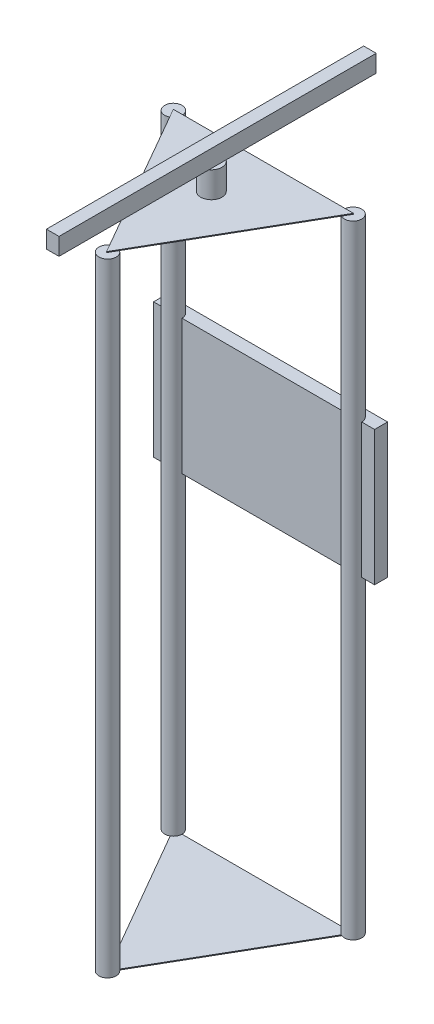
ISO-10303-21;
HEADER;
FILE_DESCRIPTION(('STEP AP214'),'2;1');
FILE_NAME('part.step','',(''),(''),'','','');
FILE_SCHEMA(('AUTOMOTIVE_DESIGN { 1 0 10303 214 1 1 1 1 }'));
ENDSEC;
DATA;
#1=APPLICATION_CONTEXT('core data for automotive mechanical design processes');
#2=APPLICATION_PROTOCOL_DEFINITION('international standard','automotive_design',2000,#1);
#3=PRODUCT_CONTEXT('',#1,'mechanical');
#4=PRODUCT('Part','Part','',(#3));
#5=PRODUCT_RELATED_PRODUCT_CATEGORY('part','',(#4));
#6=PRODUCT_DEFINITION_FORMATION('','',#4);
#7=PRODUCT_DEFINITION_CONTEXT('part definition',#1,'design');
#8=PRODUCT_DEFINITION('design','',#6,#7);
#9=PRODUCT_DEFINITION_SHAPE('','',#8);
#10=(LENGTH_UNIT() NAMED_UNIT(*) SI_UNIT(.MILLI.,.METRE.));
#11=(NAMED_UNIT(*) PLANE_ANGLE_UNIT() SI_UNIT($,.RADIAN.));
#12=(NAMED_UNIT(*) SI_UNIT($,.STERADIAN.) SOLID_ANGLE_UNIT());
#13=UNCERTAINTY_MEASURE_WITH_UNIT(LENGTH_MEASURE(1.E-05),#10,'distance_accuracy_value','');
#14=(GEOMETRIC_REPRESENTATION_CONTEXT(3) GLOBAL_UNCERTAINTY_ASSIGNED_CONTEXT((#13)) GLOBAL_UNIT_ASSIGNED_CONTEXT((#10,
#11,#12)) REPRESENTATION_CONTEXT('',''));
#15=CARTESIAN_POINT('',(0.,0.,0.));
#16=DIRECTION('',(0.,0.,1.));
#17=DIRECTION('',(1.,0.,0.));
#18=AXIS2_PLACEMENT_3D('',#15,#16,#17);
#19=CARTESIAN_POINT('',(-263.964543073504,1831.34,-152.400000000004));
#20=DIRECTION('',(0.,-1.,0.));
#21=DIRECTION('',(0.,0.,-1.));
#22=AXIS2_PLACEMENT_3D('',#19,#20,#21);
#23=CYLINDRICAL_SURFACE('',#22,25.4);
#24=CARTESIAN_POINT('',(-263.964543073504,2.54,-152.400000000004));
#25=DIRECTION('',(0.,1.,0.));
#26=DIRECTION('',(0.,0.,1.));
#27=AXIS2_PLACEMENT_3D('',#24,#25,#26);
#28=CIRCLE('',#27,25.4);
#29=CARTESIAN_POINT('',(-251.264543073504,2.54,-130.402954743879));
#30=VERTEX_POINT('',#29);
#31=CARTESIAN_POINT('',(-238.564543073504,2.54,-152.400000000004));
#32=VERTEX_POINT('',#31);
#33=EDGE_CURVE('E383',#30,#32,#28,.T.);
#34=ORIENTED_EDGE('',*,*,#33,.T.);
#35=EDGE_CURVE('E373',#32,#30,#28,.T.);
#36=ORIENTED_EDGE('',*,*,#35,.T.);
#37=EDGE_LOOP('',(#34,#36));
#38=FACE_BOUND('',#37,.T.);
#39=CARTESIAN_POINT('',(-263.964543073504,1831.34,-152.400000000004));
#40=DIRECTION('',(0.,1.,0.));
#41=DIRECTION('',(0.,0.,1.));
#42=AXIS2_PLACEMENT_3D('',#39,#40,#41);
#43=CIRCLE('',#42,25.4);
#44=CARTESIAN_POINT('',(-251.325258466089,1831.34,-130.368012241004));
#45=VERTEX_POINT('',#44);
#46=CARTESIAN_POINT('',(-238.564543073504,1831.34,-152.400000000004));
#47=VERTEX_POINT('',#46);
#48=EDGE_CURVE('E378',#45,#47,#43,.T.);
#49=ORIENTED_EDGE('',*,*,#48,.F.);
#50=EDGE_CURVE('E382',#47,#45,#43,.T.);
#51=ORIENTED_EDGE('',*,*,#50,.F.);
#52=EDGE_LOOP('',(#49,#51));
#53=FACE_BOUND('',#52,.T.);
#54=CARTESIAN_POINT('',(-263.964543073504,1315.11447139474,-152.400000000004));
#55=DIRECTION('',(0.,-1.,0.));
#56=DIRECTION('',(0.,0.,-1.));
#57=AXIS2_PLACEMENT_3D('',#54,#55,#56);
#58=CIRCLE('',#57,25.4);
#59=CARTESIAN_POINT('',(-289.364543073504,1315.11447139474,-152.400000000005));
#60=VERTEX_POINT('',#59);
#61=CARTESIAN_POINT('',(-238.564543073504,1315.11447139474,-152.400000000005));
#62=VERTEX_POINT('',#61);
#63=EDGE_CURVE('E72',#60,#62,#58,.T.);
#64=ORIENTED_EDGE('',*,*,#63,.F.);
#65=DIRECTION('',(0.,-1.,0.));
#66=VECTOR('',#65,1.);
#67=CARTESIAN_POINT('',(-289.364543073504,1831.34,-152.400000000005));
#68=LINE('',#67,#66);
#69=CARTESIAN_POINT('',(-289.364543073504,919.738310770345,-152.400000000004));
#70=VERTEX_POINT('',#69);
#71=EDGE_CURVE('E286',#60,#70,#68,.T.);
#72=ORIENTED_EDGE('',*,*,#71,.T.);
#73=CARTESIAN_POINT('',(-263.964543073504,919.738310770345,-152.400000000004));
#74=DIRECTION('',(0.,1.,0.));
#75=DIRECTION('',(0.,0.,1.));
#76=AXIS2_PLACEMENT_3D('',#73,#74,#75);
#77=CIRCLE('',#76,25.4);
#78=CARTESIAN_POINT('',(-238.564543073504,919.738310770345,-152.400000000004));
#79=VERTEX_POINT('',#78);
#80=EDGE_CURVE('E235',#79,#70,#77,.T.);
#81=ORIENTED_EDGE('',*,*,#80,.F.);
#82=DIRECTION('',(0.,-1.,0.));
#83=VECTOR('',#82,1.);
#84=CARTESIAN_POINT('',(-238.564543073504,1831.34,-152.400000000005));
#85=LINE('',#84,#83);
#86=EDGE_CURVE('E77',#79,#62,#85,.F.);
#87=ORIENTED_EDGE('',*,*,#86,.T.);
#88=EDGE_LOOP('',(#64,#72,#81,#87));
#89=FACE_BOUND('',#88,.T.);
#90=ADVANCED_FACE('F57',(#38,#53,#89),#23,.T.);
#91=CARTESIAN_POINT('',(263.964543073505,1831.34,-152.400000000004));
#92=DIRECTION('',(0.,-1.,0.));
#93=DIRECTION('',(0.,0.,-1.));
#94=AXIS2_PLACEMENT_3D('',#91,#92,#93);
#95=CYLINDRICAL_SURFACE('',#94,25.4);
#96=CARTESIAN_POINT('',(263.964543073505,2.54,-152.400000000004));
#97=DIRECTION('',(0.,1.,0.));
#98=DIRECTION('',(0.,0.,1.));
#99=AXIS2_PLACEMENT_3D('',#96,#97,#98);
#100=CIRCLE('',#99,25.4);
#101=CARTESIAN_POINT('',(238.564543073505,2.53999999999999,-152.400000000004));
#102=VERTEX_POINT('',#101);
#103=CARTESIAN_POINT('',(251.264543073505,2.54,-130.40295474388));
#104=VERTEX_POINT('',#103);
#105=EDGE_CURVE('E362',#102,#104,#100,.T.);
#106=ORIENTED_EDGE('',*,*,#105,.T.);
#107=EDGE_CURVE('E366',#104,#102,#100,.T.);
#108=ORIENTED_EDGE('',*,*,#107,.T.);
#109=EDGE_LOOP('',(#106,#108));
#110=FACE_BOUND('',#109,.T.);
#111=CARTESIAN_POINT('',(263.964543073505,1831.34,-152.400000000004));
#112=DIRECTION('',(0.,1.,0.));
#113=DIRECTION('',(0.,0.,1.));
#114=AXIS2_PLACEMENT_3D('',#111,#112,#113);
#115=CIRCLE('',#114,25.4);
#116=CARTESIAN_POINT('',(238.564543073505,1831.34,-152.400000000004));
#117=VERTEX_POINT('',#116);
#118=CARTESIAN_POINT('',(252.11665213693,1831.34,-129.932523943379));
#119=VERTEX_POINT('',#118);
#120=EDGE_CURVE('E367',#117,#119,#115,.T.);
#121=ORIENTED_EDGE('',*,*,#120,.F.);
#122=EDGE_CURVE('E359',#119,#117,#115,.T.);
#123=ORIENTED_EDGE('',*,*,#122,.F.);
#124=EDGE_LOOP('',(#121,#123));
#125=FACE_BOUND('',#124,.T.);
#126=CARTESIAN_POINT('',(263.964543073505,1315.11447139474,-152.400000000004));
#127=DIRECTION('',(0.,-1.,0.));
#128=DIRECTION('',(0.,0.,-1.));
#129=AXIS2_PLACEMENT_3D('',#126,#127,#128);
#130=CIRCLE('',#129,25.4);
#131=CARTESIAN_POINT('',(238.564543073505,1315.11447139474,-152.400000000005));
#132=VERTEX_POINT('',#131);
#133=CARTESIAN_POINT('',(289.364543073505,1315.11447139474,-152.400000000005));
#134=VERTEX_POINT('',#133);
#135=EDGE_CURVE('E13',#132,#134,#130,.T.);
#136=ORIENTED_EDGE('',*,*,#135,.F.);
#137=DIRECTION('',(0.,-1.,0.));
#138=VECTOR('',#137,1.);
#139=CARTESIAN_POINT('',(238.564543073505,1831.34,-152.400000000005));
#140=LINE('',#139,#138);
#141=CARTESIAN_POINT('',(238.564543073505,919.738310770345,-152.400000000004));
#142=VERTEX_POINT('',#141);
#143=EDGE_CURVE('E65',#132,#142,#140,.T.);
#144=ORIENTED_EDGE('',*,*,#143,.T.);
#145=CARTESIAN_POINT('',(263.964543073505,919.738310770345,-152.400000000004));
#146=DIRECTION('',(0.,1.,0.));
#147=DIRECTION('',(0.,0.,1.));
#148=AXIS2_PLACEMENT_3D('',#145,#146,#147);
#149=CIRCLE('',#148,25.4);
#150=CARTESIAN_POINT('',(289.364543073505,919.738310770345,-152.400000000004));
#151=VERTEX_POINT('',#150);
#152=EDGE_CURVE('E416',#151,#142,#149,.T.);
#153=ORIENTED_EDGE('',*,*,#152,.F.);
#154=DIRECTION('',(0.,-1.,0.));
#155=VECTOR('',#154,1.);
#156=CARTESIAN_POINT('',(289.364543073505,1831.34,-152.400000000005));
#157=LINE('',#156,#155);
#158=EDGE_CURVE('E419',#151,#134,#157,.F.);
#159=ORIENTED_EDGE('',*,*,#158,.T.);
#160=EDGE_LOOP('',(#136,#144,#153,#159));
#161=FACE_BOUND('',#160,.T.);
#162=ADVANCED_FACE('F422',(#110,#125,#161),#95,.T.);
#163=CARTESIAN_POINT('',(0.,1910.08,0.));
#164=DIRECTION('',(0.,1.,0.));
#165=DIRECTION('',(0.,0.,1.));
#166=AXIS2_PLACEMENT_3D('',#163,#164,#165);
#167=PLANE('',#166);
#168=DIRECTION('',(0.,0.,1.));
#169=VECTOR('',#168,1.);
#170=CARTESIAN_POINT('',(-18.4507159678555,1910.08,465.908665035179));
#171=LINE('',#170,#169);
#172=CARTESIAN_POINT('',(-18.4507159678555,1910.08,-25.0478078657152));
#173=VERTEX_POINT('',#172);
#174=CARTESIAN_POINT('',(-18.4507159678555,1910.08,25.0478078657152));
#175=VERTEX_POINT('',#174);
#176=EDGE_CURVE('E304',#173,#175,#171,.T.);
#177=ORIENTED_EDGE('',*,*,#176,.F.);
#178=CARTESIAN_POINT('',(0.,1910.08,0.));
#179=DIRECTION('',(0.,1.,0.));
#180=DIRECTION('',(0.,0.,1.));
#181=AXIS2_PLACEMENT_3D('',#178,#179,#180);
#182=CIRCLE('',#181,31.1098312210829);
#183=EDGE_CURVE('E590',#173,#175,#182,.T.);
#184=ORIENTED_EDGE('',*,*,#183,.T.);
#185=EDGE_LOOP('',(#177,#184));
#186=FACE_BOUND('',#185,.T.);
#187=ADVANCED_FACE('F482',(#186),#167,.T.);
#188=CARTESIAN_POINT('',(-263.964543073504,2.54,-152.400000000004));
#189=DIRECTION('',(0.866025403784438,0.,-0.5));
#190=DIRECTION('',(-0.5,0.,-0.866025403784439));
#191=AXIS2_PLACEMENT_3D('',#188,#189,#190);
#192=PLANE('',#191);
#193=DIRECTION('',(0.5,0.,0.866025403784438));
#194=VECTOR('',#193,1.);
#195=CARTESIAN_POINT('',(-263.964543073504,0.,-152.400000000004));
#196=LINE('',#195,#194);
#197=CARTESIAN_POINT('',(-263.964543073504,0.,-152.400000000004));
#198=VERTEX_POINT('',#197);
#199=CARTESIAN_POINT('',(0.,0.,304.800000000009));
#200=VERTEX_POINT('',#199);
#201=EDGE_CURVE('E381',#198,#200,#196,.T.);
#202=ORIENTED_EDGE('',*,*,#201,.T.);
#203=DIRECTION('',(0.,-1.,0.));
#204=VECTOR('',#203,1.);
#205=CARTESIAN_POINT('',(0.,2.54,304.800000000009));
#206=LINE('',#205,#204);
#207=CARTESIAN_POINT('',(0.,2.54,304.800000000009));
#208=VERTEX_POINT('',#207);
#209=EDGE_CURVE('E413',#208,#200,#206,.T.);
#210=ORIENTED_EDGE('',*,*,#209,.F.);
#211=DIRECTION('',(0.5,0.,0.866025403784438));
#212=VECTOR('',#211,1.);
#213=CARTESIAN_POINT('',(-263.964543073504,2.54,-152.400000000004));
#214=LINE('',#213,#212);
#215=CARTESIAN_POINT('',(-12.7,2.54,282.802954743884));
#216=VERTEX_POINT('',#215);
#217=EDGE_CURVE('E391',#216,#208,#214,.T.);
#218=ORIENTED_EDGE('',*,*,#217,.F.);
#219=EDGE_CURVE('E390',#30,#216,#214,.T.);
#220=ORIENTED_EDGE('',*,*,#219,.F.);
#221=CARTESIAN_POINT('',(-263.964543073504,2.54,-152.400000000004));
#222=VERTEX_POINT('',#221);
#223=EDGE_CURVE('E386',#222,#30,#214,.T.);
#224=ORIENTED_EDGE('',*,*,#223,.F.);
#225=DIRECTION('',(0.,-1.,0.));
#226=VECTOR('',#225,1.);
#227=CARTESIAN_POINT('',(-263.964543073504,2.54,-152.400000000004));
#228=LINE('',#227,#226);
#229=EDGE_CURVE('E400',#222,#198,#228,.T.);
#230=ORIENTED_EDGE('',*,*,#229,.T.);
#231=EDGE_LOOP('',(#202,#210,#218,#220,#224,#230));
#232=FACE_BOUND('',#231,.T.);
#233=ADVANCED_FACE('F59',(#232),#192,.F.);
#234=CARTESIAN_POINT('',(0.,2.54,304.800000000009));
#235=DIRECTION('',(-0.866025403784439,0.,-0.5));
#236=DIRECTION('',(-0.5,0.,0.866025403784439));
#237=AXIS2_PLACEMENT_3D('',#234,#235,#236);
#238=PLANE('',#237);
#239=DIRECTION('',(0.5,0.,-0.866025403784439));
#240=VECTOR('',#239,1.);
#241=CARTESIAN_POINT('',(0.,0.,304.800000000009));
#242=LINE('',#241,#240);
#243=CARTESIAN_POINT('',(263.964543073505,0.,-152.400000000004));
#244=VERTEX_POINT('',#243);
#245=EDGE_CURVE('E404',#200,#244,#242,.T.);
#246=ORIENTED_EDGE('',*,*,#245,.T.);
#247=DIRECTION('',(0.,-1.,0.));
#248=VECTOR('',#247,1.);
#249=CARTESIAN_POINT('',(263.964543073505,2.54,-152.400000000004));
#250=LINE('',#249,#248);
#251=CARTESIAN_POINT('',(263.964543073505,2.54,-152.400000000004));
#252=VERTEX_POINT('',#251);
#253=EDGE_CURVE('E410',#252,#244,#250,.T.);
#254=ORIENTED_EDGE('',*,*,#253,.F.);
#255=DIRECTION('',(0.5,0.,-0.866025403784439));
#256=VECTOR('',#255,1.);
#257=CARTESIAN_POINT('',(0.,2.54,304.800000000009));
#258=LINE('',#257,#256);
#259=EDGE_CURVE('E389',#104,#252,#258,.T.);
#260=ORIENTED_EDGE('',*,*,#259,.F.);
#261=CARTESIAN_POINT('',(12.7,2.53999999999999,282.802954743884));
#262=VERTEX_POINT('',#261);
#263=EDGE_CURVE('E396',#262,#104,#258,.T.);
#264=ORIENTED_EDGE('',*,*,#263,.F.);
#265=EDGE_CURVE('E392',#208,#262,#258,.T.);
#266=ORIENTED_EDGE('',*,*,#265,.F.);
#267=ORIENTED_EDGE('',*,*,#209,.T.);
#268=EDGE_LOOP('',(#246,#254,#260,#264,#266,#267));
#269=FACE_BOUND('',#268,.T.);
#270=ADVANCED_FACE('F500',(#269),#238,.F.);
#271=CARTESIAN_POINT('',(263.964543073505,2.54,-152.400000000004));
#272=DIRECTION('',(0.,0.,1.));
#273=DIRECTION('',(1.,0.,0.));
#274=AXIS2_PLACEMENT_3D('',#271,#272,#273);
#275=PLANE('',#274);
#276=DIRECTION('',(-1.,0.,0.));
#277=VECTOR('',#276,1.);
#278=CARTESIAN_POINT('',(263.964543073505,0.,-152.400000000004));
#279=LINE('',#278,#277);
#280=EDGE_CURVE('E406',#244,#198,#279,.T.);
#281=ORIENTED_EDGE('',*,*,#280,.T.);
#282=ORIENTED_EDGE('',*,*,#229,.F.);
#283=DIRECTION('',(-1.,0.,0.));
#284=VECTOR('',#283,1.);
#285=CARTESIAN_POINT('',(263.964543073505,2.54,-152.400000000004));
#286=LINE('',#285,#284);
#287=EDGE_CURVE('E395',#32,#222,#286,.T.);
#288=ORIENTED_EDGE('',*,*,#287,.F.);
#289=EDGE_CURVE('E401',#102,#32,#286,.T.);
#290=ORIENTED_EDGE('',*,*,#289,.F.);
#291=EDGE_CURVE('E397',#252,#102,#286,.T.);
#292=ORIENTED_EDGE('',*,*,#291,.F.);
#293=ORIENTED_EDGE('',*,*,#253,.T.);
#294=EDGE_LOOP('',(#281,#282,#288,#290,#292,#293));
#295=FACE_BOUND('',#294,.T.);
#296=ADVANCED_FACE('F494',(#295),#275,.F.);
#297=CARTESIAN_POINT('',(0.,2.54,0.));
#298=DIRECTION('',(0.,1.,0.));
#299=DIRECTION('',(0.,0.,1.));
#300=AXIS2_PLACEMENT_3D('',#297,#298,#299);
#301=PLANE('',#300);
#302=ORIENTED_EDGE('',*,*,#263,.T.);
#303=ORIENTED_EDGE('',*,*,#105,.F.);
#304=ORIENTED_EDGE('',*,*,#289,.T.);
#305=ORIENTED_EDGE('',*,*,#33,.F.);
#306=ORIENTED_EDGE('',*,*,#219,.T.);
#307=CARTESIAN_POINT('',(0.,2.54,304.800000000009));
#308=DIRECTION('',(0.,1.,0.));
#309=DIRECTION('',(0.,0.,1.));
#310=AXIS2_PLACEMENT_3D('',#307,#308,#309);
#311=CIRCLE('',#310,25.4);
#312=EDGE_CURVE('E370',#262,#216,#311,.T.);
#313=ORIENTED_EDGE('',*,*,#312,.F.);
#314=EDGE_LOOP('',(#302,#303,#304,#305,#306,#313));
#315=FACE_BOUND('',#314,.T.);
#316=ADVANCED_FACE('F490',(#315),#301,.T.);
#317=CARTESIAN_POINT('',(0.,0.,0.));
#318=DIRECTION('',(0.,1.,0.));
#319=DIRECTION('',(0.,0.,1.));
#320=AXIS2_PLACEMENT_3D('',#317,#318,#319);
#321=PLANE('',#320);
#322=ORIENTED_EDGE('',*,*,#201,.F.);
#323=ORIENTED_EDGE('',*,*,#280,.F.);
#324=ORIENTED_EDGE('',*,*,#245,.F.);
#325=EDGE_LOOP('',(#322,#323,#324));
#326=FACE_BOUND('',#325,.T.);
#327=ADVANCED_FACE('F493',(#326),#321,.F.);
#328=CARTESIAN_POINT('',(-263.964543073504,2.54,-152.400000000004));
#329=DIRECTION('',(0.,1.,0.));
#330=DIRECTION('',(0.,0.,1.));
#331=AXIS2_PLACEMENT_3D('',#328,#329,#330);
#332=PLANE('',#331);
#333=ORIENTED_EDGE('',*,*,#287,.T.);
#334=ORIENTED_EDGE('',*,*,#223,.T.);
#335=ORIENTED_EDGE('',*,*,#35,.F.);
#336=EDGE_LOOP('',(#333,#334,#335));
#337=FACE_BOUND('',#336,.T.);
#338=ADVANCED_FACE('F488',(#337),#332,.F.);
#339=CARTESIAN_POINT('',(-263.964543073504,1831.34,-152.400000000004));
#340=DIRECTION('',(0.,1.,0.));
#341=DIRECTION('',(0.,0.,1.));
#342=AXIS2_PLACEMENT_3D('',#339,#340,#341);
#343=PLANE('',#342);
#344=DIRECTION('',(0.49760963021322,0.,0.867401092874031));
#345=VECTOR('',#344,1.);
#346=CARTESIAN_POINT('',(-132.822896225479,1831.34,76.197681577291));
#347=LINE('',#346,#345);
#348=CARTESIAN_POINT('',(-263.964543073504,1831.34,-152.400000000004));
#349=VERTEX_POINT('',#348);
#350=EDGE_CURVE('E335',#349,#45,#347,.T.);
#351=ORIENTED_EDGE('',*,*,#350,.F.);
#352=DIRECTION('',(-1.,0.,0.));
#353=VECTOR('',#352,1.);
#354=CARTESIAN_POINT('',(0.,1831.34,-152.400000000004));
#355=LINE('',#354,#353);
#356=EDGE_CURVE('E343',#47,#349,#355,.T.);
#357=ORIENTED_EDGE('',*,*,#356,.F.);
#358=ORIENTED_EDGE('',*,*,#50,.T.);
#359=EDGE_LOOP('',(#351,#357,#358));
#360=FACE_BOUND('',#359,.T.);
#361=ADVANCED_FACE('F645',(#360),#343,.T.);
#362=CARTESIAN_POINT('',(0.,2.54,304.800000000009));
#363=DIRECTION('',(0.,1.,0.));
#364=DIRECTION('',(0.,0.,1.));
#365=AXIS2_PLACEMENT_3D('',#362,#363,#364);
#366=PLANE('',#365);
#367=EDGE_CURVE('E374',#216,#262,#311,.T.);
#368=ORIENTED_EDGE('',*,*,#367,.F.);
#369=ORIENTED_EDGE('',*,*,#217,.T.);
#370=ORIENTED_EDGE('',*,*,#265,.T.);
#371=EDGE_LOOP('',(#368,#369,#370));
#372=FACE_BOUND('',#371,.T.);
#373=ADVANCED_FACE('F529',(#372),#366,.F.);
#374=CARTESIAN_POINT('',(0.,1831.34,304.800000000009));
#375=DIRECTION('',(0.,-1.,0.));
#376=DIRECTION('',(0.,0.,-1.));
#377=AXIS2_PLACEMENT_3D('',#374,#375,#376);
#378=CYLINDRICAL_SURFACE('',#377,25.4);
#379=CARTESIAN_POINT('',(0.,1831.34,304.800000000009));
#380=DIRECTION('',(0.,1.,0.));
#381=DIRECTION('',(0.,0.,1.));
#382=AXIS2_PLACEMENT_3D('',#379,#380,#381);
#383=CIRCLE('',#382,25.4);
#384=CARTESIAN_POINT('',(13.9232604377271,1831.34,283.556111024983));
#385=VERTEX_POINT('',#384);
#386=CARTESIAN_POINT('',(-13.8814463158928,1831.34,283.528764770737));
#387=VERTEX_POINT('',#386);
#388=EDGE_CURVE('E375',#385,#387,#383,.T.);
#389=ORIENTED_EDGE('',*,*,#388,.F.);
#390=EDGE_CURVE('E365',#387,#385,#383,.T.);
#391=ORIENTED_EDGE('',*,*,#390,.F.);
#392=EDGE_LOOP('',(#389,#391));
#393=FACE_BOUND('',#392,.T.);
#394=ORIENTED_EDGE('',*,*,#312,.T.);
#395=ORIENTED_EDGE('',*,*,#367,.T.);
#396=EDGE_LOOP('',(#394,#395));
#397=FACE_BOUND('',#396,.T.);
#398=ADVANCED_FACE('F655',(#393,#397),#378,.T.);
#399=CARTESIAN_POINT('',(0.,1831.34,304.800000000009));
#400=DIRECTION('',(0.,1.,0.));
#401=DIRECTION('',(0.,0.,1.));
#402=AXIS2_PLACEMENT_3D('',#399,#400,#401);
#403=PLANE('',#402);
#404=DIRECTION('',(0.499159872059048,0.,-0.866509908844668));
#405=VECTOR('',#404,1.);
#406=CARTESIAN_POINT('',(133.099799832719,1831.34,76.6731902052547));
#407=LINE('',#406,#405);
#408=CARTESIAN_POINT('',(0.,1831.34,307.726008903489));
#409=VERTEX_POINT('',#408);
#410=EDGE_CURVE('E340',#409,#385,#407,.T.);
#411=ORIENTED_EDGE('',*,*,#410,.F.);
#412=EDGE_CURVE('E349',#387,#409,#347,.T.);
#413=ORIENTED_EDGE('',*,*,#412,.F.);
#414=ORIENTED_EDGE('',*,*,#390,.T.);
#415=EDGE_LOOP('',(#411,#413,#414));
#416=FACE_BOUND('',#415,.T.);
#417=ADVANCED_FACE('F666',(#416),#403,.T.);
#418=CARTESIAN_POINT('',(263.964543073505,2.54,-152.400000000004));
#419=DIRECTION('',(0.,1.,0.));
#420=DIRECTION('',(0.,0.,1.));
#421=AXIS2_PLACEMENT_3D('',#418,#419,#420);
#422=PLANE('',#421);
#423=ORIENTED_EDGE('',*,*,#107,.F.);
#424=ORIENTED_EDGE('',*,*,#259,.T.);
#425=ORIENTED_EDGE('',*,*,#291,.T.);
#426=EDGE_LOOP('',(#423,#424,#425));
#427=FACE_BOUND('',#426,.T.);
#428=ADVANCED_FACE('F532',(#427),#422,.F.);
#429=CARTESIAN_POINT('',(263.964543073505,1831.34,-152.400000000004));
#430=DIRECTION('',(0.,1.,0.));
#431=DIRECTION('',(0.,0.,1.));
#432=AXIS2_PLACEMENT_3D('',#429,#430,#431);
#433=PLANE('',#432);
#434=CARTESIAN_POINT('',(265.059219047523,1831.34,-152.400000000004));
#435=VERTEX_POINT('',#434);
#436=EDGE_CURVE('E345',#119,#435,#407,.T.);
#437=ORIENTED_EDGE('',*,*,#436,.F.);
#438=ORIENTED_EDGE('',*,*,#122,.T.);
#439=EDGE_CURVE('E346',#435,#117,#355,.T.);
#440=ORIENTED_EDGE('',*,*,#439,.F.);
#441=EDGE_LOOP('',(#437,#438,#440));
#442=FACE_BOUND('',#441,.T.);
#443=ADVANCED_FACE('F541',(#442),#433,.T.);
#444=CARTESIAN_POINT('',(0.,1831.34,0.));
#445=DIRECTION('',(0.,1.,0.));
#446=DIRECTION('',(0.,0.,1.));
#447=AXIS2_PLACEMENT_3D('',#444,#445,#446);
#448=PLANE('',#447);
#449=EDGE_CURVE('E353',#45,#387,#347,.T.);
#450=ORIENTED_EDGE('',*,*,#449,.F.);
#451=ORIENTED_EDGE('',*,*,#48,.T.);
#452=EDGE_CURVE('E350',#117,#47,#355,.T.);
#453=ORIENTED_EDGE('',*,*,#452,.F.);
#454=ORIENTED_EDGE('',*,*,#120,.T.);
#455=EDGE_CURVE('E344',#385,#119,#407,.T.);
#456=ORIENTED_EDGE('',*,*,#455,.F.);
#457=ORIENTED_EDGE('',*,*,#388,.T.);
#458=EDGE_LOOP('',(#450,#451,#453,#454,#456,#457));
#459=FACE_BOUND('',#458,.T.);
#460=ADVANCED_FACE('F545',(#459),#448,.F.);
#461=CARTESIAN_POINT('',(-132.822896225479,1833.88,76.197681577291));
#462=DIRECTION('',(0.867401092874031,0.,-0.497609630213219));
#463=DIRECTION('',(-0.497609630213219,0.,-0.867401092874031));
#464=AXIS2_PLACEMENT_3D('',#461,#462,#463);
#465=PLANE('',#464);
#466=ORIENTED_EDGE('',*,*,#350,.T.);
#467=ORIENTED_EDGE('',*,*,#449,.T.);
#468=ORIENTED_EDGE('',*,*,#412,.T.);
#469=DIRECTION('',(0.,-1.,0.));
#470=VECTOR('',#469,1.);
#471=CARTESIAN_POINT('',(0.,1833.88,307.726008903489));
#472=LINE('',#471,#470);
#473=CARTESIAN_POINT('',(0.,1833.88,307.726008903489));
#474=VERTEX_POINT('',#473);
#475=EDGE_CURVE('E339',#474,#409,#472,.T.);
#476=ORIENTED_EDGE('',*,*,#475,.F.);
#477=DIRECTION('',(0.49760963021322,0.,0.867401092874031));
#478=VECTOR('',#477,1.);
#479=CARTESIAN_POINT('',(-132.822896225479,1833.88,76.197681577291));
#480=LINE('',#479,#478);
#481=CARTESIAN_POINT('',(-263.964543073504,1833.88,-152.400000000004));
#482=VERTEX_POINT('',#481);
#483=EDGE_CURVE('E337',#482,#474,#480,.T.);
#484=ORIENTED_EDGE('',*,*,#483,.F.);
#485=DIRECTION('',(0.,-1.,0.));
#486=VECTOR('',#485,1.);
#487=CARTESIAN_POINT('',(-263.964543073504,1833.88,-152.400000000004));
#488=LINE('',#487,#486);
#489=EDGE_CURVE('E326',#482,#349,#488,.T.);
#490=ORIENTED_EDGE('',*,*,#489,.T.);
#491=EDGE_LOOP('',(#466,#467,#468,#476,#484,#490));
#492=FACE_BOUND('',#491,.T.);
#493=ADVANCED_FACE('F706',(#492),#465,.F.);
#494=CARTESIAN_POINT('',(0.,1833.88,-152.400000000004));
#495=DIRECTION('',(0.,0.,1.));
#496=DIRECTION('',(1.,0.,0.));
#497=AXIS2_PLACEMENT_3D('',#494,#495,#496);
#498=PLANE('',#497);
#499=ORIENTED_EDGE('',*,*,#439,.T.);
#500=ORIENTED_EDGE('',*,*,#452,.T.);
#501=ORIENTED_EDGE('',*,*,#356,.T.);
#502=ORIENTED_EDGE('',*,*,#489,.F.);
#503=DIRECTION('',(-1.,0.,0.));
#504=VECTOR('',#503,1.);
#505=CARTESIAN_POINT('',(0.,1833.88,-152.400000000004));
#506=LINE('',#505,#504);
#507=CARTESIAN_POINT('',(265.059219047523,1833.88,-152.400000000004));
#508=VERTEX_POINT('',#507);
#509=EDGE_CURVE('E334',#508,#482,#506,.T.);
#510=ORIENTED_EDGE('',*,*,#509,.F.);
#511=DIRECTION('',(0.,-1.,0.));
#512=VECTOR('',#511,1.);
#513=CARTESIAN_POINT('',(265.059219047523,1833.88,-152.400000000004));
#514=LINE('',#513,#512);
#515=EDGE_CURVE('E356',#508,#435,#514,.T.);
#516=ORIENTED_EDGE('',*,*,#515,.T.);
#517=EDGE_LOOP('',(#499,#500,#501,#502,#510,#516));
#518=FACE_BOUND('',#517,.T.);
#519=ADVANCED_FACE('F549',(#518),#498,.F.);
#520=CARTESIAN_POINT('',(133.099799832719,1833.88,76.6731902052547));
#521=DIRECTION('',(-0.866509908844668,0.,-0.499159872059048));
#522=DIRECTION('',(-0.499159872059048,0.,0.866509908844668));
#523=AXIS2_PLACEMENT_3D('',#520,#521,#522);
#524=PLANE('',#523);
#525=ORIENTED_EDGE('',*,*,#410,.T.);
#526=ORIENTED_EDGE('',*,*,#455,.T.);
#527=ORIENTED_EDGE('',*,*,#436,.T.);
#528=ORIENTED_EDGE('',*,*,#515,.F.);
#529=DIRECTION('',(0.499159872059048,0.,-0.866509908844668));
#530=VECTOR('',#529,1.);
#531=CARTESIAN_POINT('',(133.099799832719,1833.88,76.6731902052547));
#532=LINE('',#531,#530);
#533=EDGE_CURVE('E331',#474,#508,#532,.T.);
#534=ORIENTED_EDGE('',*,*,#533,.F.);
#535=ORIENTED_EDGE('',*,*,#475,.T.);
#536=EDGE_LOOP('',(#525,#526,#527,#528,#534,#535));
#537=FACE_BOUND('',#536,.T.);
#538=ADVANCED_FACE('F554',(#537),#524,.F.);
#539=CARTESIAN_POINT('',(0.,1833.88,0.));
#540=DIRECTION('',(0.,1.,0.));
#541=DIRECTION('',(0.,0.,1.));
#542=AXIS2_PLACEMENT_3D('',#539,#540,#541);
#543=PLANE('',#542);
#544=CARTESIAN_POINT('',(0.,1833.88,0.));
#545=DIRECTION('',(0.,1.,0.));
#546=DIRECTION('',(0.,0.,1.));
#547=AXIS2_PLACEMENT_3D('',#544,#545,#546);
#548=CIRCLE('',#547,31.1098312210829);
#549=CARTESIAN_POINT('',(0.,1833.88,31.1098312210829));
#550=VERTEX_POINT('',#549);
#551=EDGE_CURVE('E323',#550,#550,#548,.T.);
#552=ORIENTED_EDGE('',*,*,#551,.F.);
#553=EDGE_LOOP('',(#552));
#554=FACE_BOUND('',#553,.T.);
#555=ORIENTED_EDGE('',*,*,#533,.T.);
#556=ORIENTED_EDGE('',*,*,#509,.T.);
#557=ORIENTED_EDGE('',*,*,#483,.T.);
#558=EDGE_LOOP('',(#555,#556,#557));
#559=FACE_BOUND('',#558,.T.);
#560=ADVANCED_FACE('F603',(#554,#559),#543,.T.);
#561=CARTESIAN_POINT('',(0.,1910.08,0.));
#562=DIRECTION('',(0.,-1.,0.));
#563=DIRECTION('',(0.,0.,-1.));
#564=AXIS2_PLACEMENT_3D('',#561,#562,#563);
#565=CYLINDRICAL_SURFACE('',#564,31.1098312210829);
#566=CARTESIAN_POINT('',(18.4507159678555,1910.08,25.0478078657152));
#567=VERTEX_POINT('',#566);
#568=CARTESIAN_POINT('',(18.4507159678555,1910.08,-25.0478078657152));
#569=VERTEX_POINT('',#568);
#570=EDGE_CURVE('E324',#567,#569,#182,.T.);
#571=ORIENTED_EDGE('',*,*,#570,.F.);
#572=EDGE_CURVE('E328',#175,#567,#182,.T.);
#573=ORIENTED_EDGE('',*,*,#572,.F.);
#574=ORIENTED_EDGE('',*,*,#183,.F.);
#575=EDGE_CURVE('E327',#569,#173,#182,.T.);
#576=ORIENTED_EDGE('',*,*,#575,.F.);
#577=EDGE_LOOP('',(#571,#573,#574,#576));
#578=FACE_BOUND('',#577,.T.);
#579=ORIENTED_EDGE('',*,*,#551,.T.);
#580=EDGE_LOOP('',(#579));
#581=FACE_BOUND('',#580,.T.);
#582=ADVANCED_FACE('F592',(#578,#581),#565,.T.);
#583=DIRECTION('',(0.,0.,-1.));
#584=VECTOR('',#583,1.);
#585=CARTESIAN_POINT('',(18.4507159678555,1910.08,465.908665035179));
#586=LINE('',#585,#584);
#587=EDGE_CURVE('E310',#567,#569,#586,.T.);
#588=ORIENTED_EDGE('',*,*,#587,.F.);
#589=ORIENTED_EDGE('',*,*,#570,.T.);
#590=EDGE_LOOP('',(#588,#589));
#591=FACE_BOUND('',#590,.T.);
#592=ADVANCED_FACE('F595',(#591),#167,.T.);
#593=CARTESIAN_POINT('',(0.,1910.08,0.));
#594=DIRECTION('',(0.,1.,0.));
#595=DIRECTION('',(0.,0.,1.));
#596=AXIS2_PLACEMENT_3D('',#593,#594,#595);
#597=PLANE('',#596);
#598=CARTESIAN_POINT('',(18.4507159678555,1910.08,-465.908665035179));
#599=VERTEX_POINT('',#598);
#600=EDGE_CURVE('E306',#569,#599,#586,.T.);
#601=ORIENTED_EDGE('',*,*,#600,.F.);
#602=ORIENTED_EDGE('',*,*,#575,.T.);
#603=CARTESIAN_POINT('',(-18.4507159678555,1910.08,-465.908665035179));
#604=VERTEX_POINT('',#603);
#605=EDGE_CURVE('E300',#604,#173,#171,.T.);
#606=ORIENTED_EDGE('',*,*,#605,.F.);
#607=DIRECTION('',(-1.,0.,0.));
#608=VECTOR('',#607,1.);
#609=CARTESIAN_POINT('',(18.4507159678555,1910.08,-465.908665035179));
#610=LINE('',#609,#608);
#611=EDGE_CURVE('E293',#599,#604,#610,.T.);
#612=ORIENTED_EDGE('',*,*,#611,.F.);
#613=EDGE_LOOP('',(#601,#602,#606,#612));
#614=FACE_BOUND('',#613,.T.);
#615=ADVANCED_FACE('F570',(#614),#597,.F.);
#616=CARTESIAN_POINT('',(-18.4507159678555,1910.08,465.908665035179));
#617=VERTEX_POINT('',#616);
#618=EDGE_CURVE('E288',#175,#617,#171,.T.);
#619=ORIENTED_EDGE('',*,*,#618,.F.);
#620=ORIENTED_EDGE('',*,*,#572,.T.);
#621=CARTESIAN_POINT('',(18.4507159678555,1910.08,465.908665035179));
#622=VERTEX_POINT('',#621);
#623=EDGE_CURVE('E307',#622,#567,#586,.T.);
#624=ORIENTED_EDGE('',*,*,#623,.F.);
#625=DIRECTION('',(1.,0.,0.));
#626=VECTOR('',#625,1.);
#627=CARTESIAN_POINT('',(18.4507159678555,1910.08,465.908665035179));
#628=LINE('',#627,#626);
#629=EDGE_CURVE('E303',#617,#622,#628,.T.);
#630=ORIENTED_EDGE('',*,*,#629,.F.);
#631=EDGE_LOOP('',(#619,#620,#624,#630));
#632=FACE_BOUND('',#631,.T.);
#633=ADVANCED_FACE('F585',(#632),#597,.F.);
#634=CARTESIAN_POINT('',(-18.4507159678555,1960.88,465.908665035179));
#635=DIRECTION('',(1.,0.,0.));
#636=DIRECTION('',(0.,0.,-1.));
#637=AXIS2_PLACEMENT_3D('',#634,#635,#636);
#638=PLANE('',#637);
#639=ORIENTED_EDGE('',*,*,#605,.T.);
#640=ORIENTED_EDGE('',*,*,#176,.T.);
#641=ORIENTED_EDGE('',*,*,#618,.T.);
#642=DIRECTION('',(0.,-1.,0.));
#643=VECTOR('',#642,1.);
#644=CARTESIAN_POINT('',(-18.4507159678555,1960.88,465.908665035179));
#645=LINE('',#644,#643);
#646=CARTESIAN_POINT('',(-18.4507159678555,1960.88,465.908665035179));
#647=VERTEX_POINT('',#646);
#648=EDGE_CURVE('E320',#647,#617,#645,.T.);
#649=ORIENTED_EDGE('',*,*,#648,.F.);
#650=DIRECTION('',(0.,0.,1.));
#651=VECTOR('',#650,1.);
#652=CARTESIAN_POINT('',(-18.4507159678555,1960.88,465.908665035179));
#653=LINE('',#652,#651);
#654=CARTESIAN_POINT('',(-18.4507159678555,1960.88,-465.908665035179));
#655=VERTEX_POINT('',#654);
#656=EDGE_CURVE('E289',#655,#647,#653,.T.);
#657=ORIENTED_EDGE('',*,*,#656,.F.);
#658=DIRECTION('',(0.,-1.,0.));
#659=VECTOR('',#658,1.);
#660=CARTESIAN_POINT('',(-18.4507159678555,1960.88,-465.908665035179));
#661=LINE('',#660,#659);
#662=EDGE_CURVE('E299',#655,#604,#661,.T.);
#663=ORIENTED_EDGE('',*,*,#662,.T.);
#664=EDGE_LOOP('',(#639,#640,#641,#649,#657,#663));
#665=FACE_BOUND('',#664,.T.);
#666=ADVANCED_FACE('F573',(#665),#638,.F.);
#667=CARTESIAN_POINT('',(18.4507159678555,1960.88,465.908665035179));
#668=DIRECTION('',(0.,0.,-1.));
#669=DIRECTION('',(-1.,0.,0.));
#670=AXIS2_PLACEMENT_3D('',#667,#668,#669);
#671=PLANE('',#670);
#672=ORIENTED_EDGE('',*,*,#629,.T.);
#673=DIRECTION('',(0.,-1.,0.));
#674=VECTOR('',#673,1.);
#675=CARTESIAN_POINT('',(18.4507159678555,1960.88,465.908665035179));
#676=LINE('',#675,#674);
#677=CARTESIAN_POINT('',(18.4507159678555,1960.88,465.908665035179));
#678=VERTEX_POINT('',#677);
#679=EDGE_CURVE('E317',#678,#622,#676,.T.);
#680=ORIENTED_EDGE('',*,*,#679,.F.);
#681=DIRECTION('',(1.,0.,0.));
#682=VECTOR('',#681,1.);
#683=CARTESIAN_POINT('',(18.4507159678555,1960.88,465.908665035179));
#684=LINE('',#683,#682);
#685=EDGE_CURVE('E292',#647,#678,#684,.T.);
#686=ORIENTED_EDGE('',*,*,#685,.F.);
#687=ORIENTED_EDGE('',*,*,#648,.T.);
#688=EDGE_LOOP('',(#672,#680,#686,#687));
#689=FACE_BOUND('',#688,.T.);
#690=ADVANCED_FACE('F774',(#689),#671,.F.);
#691=CARTESIAN_POINT('',(18.4507159678555,1960.88,465.908665035179));
#692=DIRECTION('',(-1.,0.,0.));
#693=DIRECTION('',(0.,0.,1.));
#694=AXIS2_PLACEMENT_3D('',#691,#692,#693);
#695=PLANE('',#694);
#696=ORIENTED_EDGE('',*,*,#623,.T.);
#697=ORIENTED_EDGE('',*,*,#587,.T.);
#698=ORIENTED_EDGE('',*,*,#600,.T.);
#699=DIRECTION('',(0.,-1.,0.));
#700=VECTOR('',#699,1.);
#701=CARTESIAN_POINT('',(18.4507159678555,1960.88,-465.908665035179));
#702=LINE('',#701,#700);
#703=CARTESIAN_POINT('',(18.4507159678555,1960.88,-465.908665035179));
#704=VERTEX_POINT('',#703);
#705=EDGE_CURVE('E314',#704,#599,#702,.T.);
#706=ORIENTED_EDGE('',*,*,#705,.F.);
#707=DIRECTION('',(0.,0.,-1.));
#708=VECTOR('',#707,1.);
#709=CARTESIAN_POINT('',(18.4507159678555,1960.88,465.908665035179));
#710=LINE('',#709,#708);
#711=EDGE_CURVE('E295',#678,#704,#710,.T.);
#712=ORIENTED_EDGE('',*,*,#711,.F.);
#713=ORIENTED_EDGE('',*,*,#679,.T.);
#714=EDGE_LOOP('',(#696,#697,#698,#706,#712,#713));
#715=FACE_BOUND('',#714,.T.);
#716=ADVANCED_FACE('F560',(#715),#695,.F.);
#717=CARTESIAN_POINT('',(18.4507159678555,1960.88,-465.908665035179));
#718=DIRECTION('',(0.,0.,1.));
#719=DIRECTION('',(1.,0.,0.));
#720=AXIS2_PLACEMENT_3D('',#717,#718,#719);
#721=PLANE('',#720);
#722=ORIENTED_EDGE('',*,*,#611,.T.);
#723=ORIENTED_EDGE('',*,*,#662,.F.);
#724=DIRECTION('',(-1.,0.,0.));
#725=VECTOR('',#724,1.);
#726=CARTESIAN_POINT('',(18.4507159678555,1960.88,-465.908665035179));
#727=LINE('',#726,#725);
#728=EDGE_CURVE('E297',#704,#655,#727,.T.);
#729=ORIENTED_EDGE('',*,*,#728,.F.);
#730=ORIENTED_EDGE('',*,*,#705,.T.);
#731=EDGE_LOOP('',(#722,#723,#729,#730));
#732=FACE_BOUND('',#731,.T.);
#733=ADVANCED_FACE('F567',(#732),#721,.F.);
#734=CARTESIAN_POINT('',(0.,1960.88,0.));
#735=DIRECTION('',(0.,1.,0.));
#736=DIRECTION('',(0.,0.,1.));
#737=AXIS2_PLACEMENT_3D('',#734,#735,#736);
#738=PLANE('',#737);
#739=ORIENTED_EDGE('',*,*,#656,.T.);
#740=ORIENTED_EDGE('',*,*,#685,.T.);
#741=ORIENTED_EDGE('',*,*,#711,.T.);
#742=ORIENTED_EDGE('',*,*,#728,.T.);
#743=EDGE_LOOP('',(#739,#740,#741,#742));
#744=FACE_BOUND('',#743,.T.);
#745=ADVANCED_FACE('F577',(#744),#738,.T.);
#746=CARTESIAN_POINT('',(0.,0.,-152.400000000005));
#747=DIRECTION('',(0.,0.,1.));
#748=DIRECTION('',(1.,0.,0.));
#749=AXIS2_PLACEMENT_3D('',#746,#747,#748);
#750=PLANE('',#749);
#751=ORIENTED_EDGE('',*,*,#71,.F.);
#752=DIRECTION('',(-1.,0.,0.));
#753=VECTOR('',#752,1.);
#754=CARTESIAN_POINT('',(327.254814747262,1315.11447139474,-152.400000000004));
#755=LINE('',#754,#753);
#756=CARTESIAN_POINT('',(-322.032641690965,1315.11447139474,-152.400000000004));
#757=VERTEX_POINT('',#756);
#758=EDGE_CURVE('E253',#60,#757,#755,.T.);
#759=ORIENTED_EDGE('',*,*,#758,.T.);
#760=DIRECTION('',(0.,-1.,0.));
#761=VECTOR('',#760,1.);
#762=CARTESIAN_POINT('',(-322.032641690965,1315.11447139474,-152.400000000004));
#763=LINE('',#762,#761);
#764=CARTESIAN_POINT('',(-322.032641690965,919.738310770345,-152.400000000004));
#765=VERTEX_POINT('',#764);
#766=EDGE_CURVE('E245',#757,#765,#763,.T.);
#767=ORIENTED_EDGE('',*,*,#766,.T.);
#768=DIRECTION('',(1.,0.,0.));
#769=VECTOR('',#768,1.);
#770=CARTESIAN_POINT('',(327.254814747262,919.738310770345,-152.400000000004));
#771=LINE('',#770,#769);
#772=EDGE_CURVE('E229',#765,#70,#771,.T.);
#773=ORIENTED_EDGE('',*,*,#772,.T.);
#774=EDGE_LOOP('',(#751,#759,#767,#773));
#775=FACE_BOUND('',#774,.T.);
#776=ADVANCED_FACE('F251',(#775),#750,.T.);
#777=ORIENTED_EDGE('',*,*,#86,.F.);
#778=EDGE_CURVE('E239',#79,#142,#771,.T.);
#779=ORIENTED_EDGE('',*,*,#778,.T.);
#780=ORIENTED_EDGE('',*,*,#143,.F.);
#781=EDGE_CURVE('E278',#132,#62,#755,.T.);
#782=ORIENTED_EDGE('',*,*,#781,.T.);
#783=EDGE_LOOP('',(#777,#779,#780,#782));
#784=FACE_BOUND('',#783,.T.);
#785=ADVANCED_FACE('F428',(#784),#750,.T.);
#786=ORIENTED_EDGE('',*,*,#158,.F.);
#787=CARTESIAN_POINT('',(327.254814747262,919.738310770345,-152.400000000004));
#788=VERTEX_POINT('',#787);
#789=EDGE_CURVE('E248',#151,#788,#771,.T.);
#790=ORIENTED_EDGE('',*,*,#789,.T.);
#791=DIRECTION('',(0.,1.,0.));
#792=VECTOR('',#791,1.);
#793=CARTESIAN_POINT('',(327.254814747262,1315.11447139474,-152.400000000004));
#794=LINE('',#793,#792);
#795=CARTESIAN_POINT('',(327.254814747262,1315.11447139474,-152.400000000004));
#796=VERTEX_POINT('',#795);
#797=EDGE_CURVE('E445',#788,#796,#794,.T.);
#798=ORIENTED_EDGE('',*,*,#797,.T.);
#799=EDGE_CURVE('E281',#796,#134,#755,.T.);
#800=ORIENTED_EDGE('',*,*,#799,.T.);
#801=EDGE_LOOP('',(#786,#790,#798,#800));
#802=FACE_BOUND('',#801,.T.);
#803=ADVANCED_FACE('F443',(#802),#750,.T.);
#804=CARTESIAN_POINT('',(0.,0.,-190.500000000005));
#805=DIRECTION('',(0.,0.,1.));
#806=DIRECTION('',(1.,0.,0.));
#807=AXIS2_PLACEMENT_3D('',#804,#805,#806);
#808=PLANE('',#807);
#809=DIRECTION('',(-1.,0.,0.));
#810=VECTOR('',#809,1.);
#811=CARTESIAN_POINT('',(327.254814747262,1315.11447139474,-190.500000000004));
#812=LINE('',#811,#810);
#813=CARTESIAN_POINT('',(327.254814747262,1315.11447139474,-190.500000000004));
#814=VERTEX_POINT('',#813);
#815=CARTESIAN_POINT('',(-322.032641690965,1315.11447139474,-190.500000000004));
#816=VERTEX_POINT('',#815);
#817=EDGE_CURVE('E267',#814,#816,#812,.T.);
#818=ORIENTED_EDGE('',*,*,#817,.F.);
#819=DIRECTION('',(0.,1.,0.));
#820=VECTOR('',#819,1.);
#821=CARTESIAN_POINT('',(327.254814747262,1315.11447139474,-190.500000000004));
#822=LINE('',#821,#820);
#823=CARTESIAN_POINT('',(327.254814747262,919.738310770345,-190.500000000004));
#824=VERTEX_POINT('',#823);
#825=EDGE_CURVE('E435',#824,#814,#822,.T.);
#826=ORIENTED_EDGE('',*,*,#825,.F.);
#827=DIRECTION('',(1.,0.,0.));
#828=VECTOR('',#827,1.);
#829=CARTESIAN_POINT('',(327.254814747262,919.738310770345,-190.500000000004));
#830=LINE('',#829,#828);
#831=CARTESIAN_POINT('',(-322.032641690965,919.738310770345,-190.500000000004));
#832=VERTEX_POINT('',#831);
#833=EDGE_CURVE('E249',#832,#824,#830,.T.);
#834=ORIENTED_EDGE('',*,*,#833,.F.);
#835=DIRECTION('',(0.,-1.,0.));
#836=VECTOR('',#835,1.);
#837=CARTESIAN_POINT('',(-322.032641690965,1315.11447139474,-190.500000000004));
#838=LINE('',#837,#836);
#839=EDGE_CURVE('E238',#816,#832,#838,.T.);
#840=ORIENTED_EDGE('',*,*,#839,.F.);
#841=EDGE_LOOP('',(#818,#826,#834,#840));
#842=FACE_BOUND('',#841,.T.);
#843=ADVANCED_FACE('F466',(#842),#808,.F.);
#844=CARTESIAN_POINT('',(327.254814747262,1315.11447139474,-152.400000000004));
#845=DIRECTION('',(0.,-1.,0.));
#846=DIRECTION('',(0.,0.,-1.));
#847=AXIS2_PLACEMENT_3D('',#844,#845,#846);
#848=PLANE('',#847);
#849=ORIENTED_EDGE('',*,*,#758,.F.);
#850=ORIENTED_EDGE('',*,*,#63,.T.);
#851=ORIENTED_EDGE('',*,*,#781,.F.);
#852=ORIENTED_EDGE('',*,*,#135,.T.);
#853=ORIENTED_EDGE('',*,*,#799,.F.);
#854=DIRECTION('',(0.,0.,-1.));
#855=VECTOR('',#854,1.);
#856=CARTESIAN_POINT('',(327.254814747262,1315.11447139474,-152.400000000004));
#857=LINE('',#856,#855);
#858=EDGE_CURVE('E283',#796,#814,#857,.T.);
#859=ORIENTED_EDGE('',*,*,#858,.T.);
#860=ORIENTED_EDGE('',*,*,#817,.T.);
#861=DIRECTION('',(0.,0.,-1.));
#862=VECTOR('',#861,1.);
#863=CARTESIAN_POINT('',(-322.032641690965,1315.11447139474,-152.400000000004));
#864=LINE('',#863,#862);
#865=EDGE_CURVE('E432',#757,#816,#864,.T.);
#866=ORIENTED_EDGE('',*,*,#865,.F.);
#867=EDGE_LOOP('',(#849,#850,#851,#852,#853,#859,#860,#866));
#868=FACE_BOUND('',#867,.T.);
#869=ADVANCED_FACE('F430',(#868),#848,.F.);
#870=CARTESIAN_POINT('',(327.254814747262,1315.11447139474,-152.400000000004));
#871=DIRECTION('',(-1.,0.,0.));
#872=DIRECTION('',(0.,0.,1.));
#873=AXIS2_PLACEMENT_3D('',#870,#871,#872);
#874=PLANE('',#873);
#875=ORIENTED_EDGE('',*,*,#825,.T.);
#876=ORIENTED_EDGE('',*,*,#858,.F.);
#877=ORIENTED_EDGE('',*,*,#797,.F.);
#878=DIRECTION('',(0.,0.,-1.));
#879=VECTOR('',#878,1.);
#880=CARTESIAN_POINT('',(327.254814747262,919.738310770345,-152.400000000004));
#881=LINE('',#880,#879);
#882=EDGE_CURVE('E437',#788,#824,#881,.T.);
#883=ORIENTED_EDGE('',*,*,#882,.T.);
#884=EDGE_LOOP('',(#875,#876,#877,#883));
#885=FACE_BOUND('',#884,.T.);
#886=ADVANCED_FACE('F448',(#885),#874,.F.);
#887=CARTESIAN_POINT('',(327.254814747262,919.738310770345,-152.400000000004));
#888=DIRECTION('',(0.,1.,0.));
#889=DIRECTION('',(0.,0.,1.));
#890=AXIS2_PLACEMENT_3D('',#887,#888,#889);
#891=PLANE('',#890);
#892=ORIENTED_EDGE('',*,*,#778,.F.);
#893=ORIENTED_EDGE('',*,*,#80,.T.);
#894=ORIENTED_EDGE('',*,*,#772,.F.);
#895=DIRECTION('',(0.,0.,-1.));
#896=VECTOR('',#895,1.);
#897=CARTESIAN_POINT('',(-322.032641690965,919.738310770345,-152.400000000004));
#898=LINE('',#897,#896);
#899=EDGE_CURVE('E233',#765,#832,#898,.T.);
#900=ORIENTED_EDGE('',*,*,#899,.T.);
#901=ORIENTED_EDGE('',*,*,#833,.T.);
#902=ORIENTED_EDGE('',*,*,#882,.F.);
#903=ORIENTED_EDGE('',*,*,#789,.F.);
#904=ORIENTED_EDGE('',*,*,#152,.T.);
#905=EDGE_LOOP('',(#892,#893,#894,#900,#901,#902,#903,#904));
#906=FACE_BOUND('',#905,.T.);
#907=ADVANCED_FACE('F232',(#906),#891,.F.);
#908=CARTESIAN_POINT('',(-322.032641690965,1315.11447139474,-152.400000000004));
#909=DIRECTION('',(1.,0.,0.));
#910=DIRECTION('',(0.,1.,0.));
#911=AXIS2_PLACEMENT_3D('',#908,#909,#910);
#912=PLANE('',#911);
#913=ORIENTED_EDGE('',*,*,#839,.T.);
#914=ORIENTED_EDGE('',*,*,#899,.F.);
#915=ORIENTED_EDGE('',*,*,#766,.F.);
#916=ORIENTED_EDGE('',*,*,#865,.T.);
#917=EDGE_LOOP('',(#913,#914,#915,#916));
#918=FACE_BOUND('',#917,.T.);
#919=ADVANCED_FACE('F243',(#918),#912,.F.);
#920=CLOSED_SHELL('',(#90,#162,#187,#233,#270,#296,#316,#327,#338,#361,#373,#398,#417,#428,#443,
#460,#493,#519,#538,#560,#582,#592,#615,#633,#666,#690,#716,#733,#745,#776,#785,#803,#843,#869,
#886,#907,#919));
#921=MANIFOLD_SOLID_BREP('B2',#920);
#922=ADVANCED_BREP_SHAPE_REPRESENTATION('',(#18,#921),#14);
#923=SHAPE_DEFINITION_REPRESENTATION(#9,#922);
ENDSEC;
END-ISO-10303-21;
